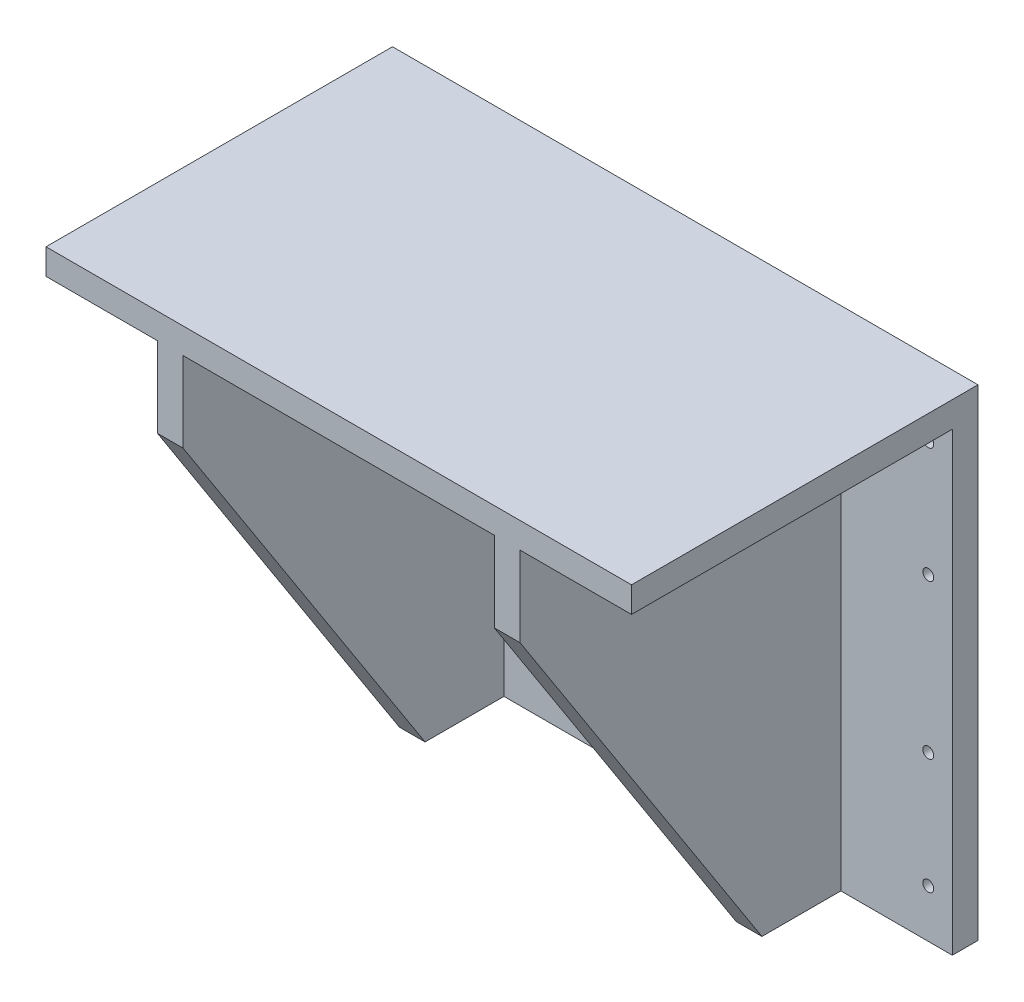
ISO-10303-21;
HEADER;
FILE_DESCRIPTION(('STEP AP214'),'2;1');
FILE_NAME('part.step','',(''),(''),'','','');
FILE_SCHEMA(('AUTOMOTIVE_DESIGN { 1 0 10303 214 1 1 1 1 }'));
ENDSEC;
DATA;
#1=APPLICATION_CONTEXT('core data for automotive mechanical design processes');
#2=APPLICATION_PROTOCOL_DEFINITION('international standard','automotive_design',2000,#1);
#3=PRODUCT_CONTEXT('',#1,'mechanical');
#4=PRODUCT('Part','Part','',(#3));
#5=PRODUCT_RELATED_PRODUCT_CATEGORY('part','',(#4));
#6=PRODUCT_DEFINITION_FORMATION('','',#4);
#7=PRODUCT_DEFINITION_CONTEXT('part definition',#1,'design');
#8=PRODUCT_DEFINITION('design','',#6,#7);
#9=PRODUCT_DEFINITION_SHAPE('','',#8);
#10=(LENGTH_UNIT() NAMED_UNIT(*) SI_UNIT(.MILLI.,.METRE.));
#11=(NAMED_UNIT(*) PLANE_ANGLE_UNIT() SI_UNIT($,.RADIAN.));
#12=(NAMED_UNIT(*) SI_UNIT($,.STERADIAN.) SOLID_ANGLE_UNIT());
#13=UNCERTAINTY_MEASURE_WITH_UNIT(LENGTH_MEASURE(1.E-05),#10,'distance_accuracy_value','');
#14=(GEOMETRIC_REPRESENTATION_CONTEXT(3) GLOBAL_UNCERTAINTY_ASSIGNED_CONTEXT((#13)) GLOBAL_UNIT_ASSIGNED_CONTEXT((#10,
#11,#12)) REPRESENTATION_CONTEXT('',''));
#15=CARTESIAN_POINT('',(0.,0.,0.));
#16=DIRECTION('',(0.,0.,1.));
#17=DIRECTION('',(1.,0.,0.));
#18=AXIS2_PLACEMENT_3D('',#15,#16,#17);
#19=CARTESIAN_POINT('',(-182.5,-300.,16.));
#20=DIRECTION('',(0.,0.,1.));
#21=DIRECTION('',(1.,0.,0.));
#22=AXIS2_PLACEMENT_3D('',#19,#20,#21);
#23=PLANE('',#22);
#24=DIRECTION('',(1.,0.,0.));
#25=VECTOR('',#24,1.);
#26=CARTESIAN_POINT('',(-182.5,-16.,16.));
#27=LINE('',#26,#25);
#28=CARTESIAN_POINT('',(-97.,-16.,16.));
#29=VERTEX_POINT('',#28);
#30=CARTESIAN_POINT('',(97.,-16.,16.));
#31=VERTEX_POINT('',#30);
#32=EDGE_CURVE('E38',#29,#31,#27,.T.);
#33=ORIENTED_EDGE('',*,*,#32,.F.);
#34=DIRECTION('',(0.,-1.,0.));
#35=VECTOR('',#34,1.);
#36=CARTESIAN_POINT('',(-97.,-16.,16.));
#37=LINE('',#36,#35);
#38=CARTESIAN_POINT('',(-97.,-300.,16.));
#39=VERTEX_POINT('',#38);
#40=EDGE_CURVE('E226',#29,#39,#37,.T.);
#41=ORIENTED_EDGE('',*,*,#40,.T.);
#42=DIRECTION('',(1.,0.,0.));
#43=VECTOR('',#42,1.);
#44=CARTESIAN_POINT('',(-182.5,-300.,16.));
#45=LINE('',#44,#43);
#46=CARTESIAN_POINT('',(97.,-300.,16.));
#47=VERTEX_POINT('',#46);
#48=EDGE_CURVE('E384',#39,#47,#45,.T.);
#49=ORIENTED_EDGE('',*,*,#48,.T.);
#50=DIRECTION('',(0.,1.,0.));
#51=VECTOR('',#50,1.);
#52=CARTESIAN_POINT('',(97.,-300.,16.));
#53=LINE('',#52,#51);
#54=EDGE_CURVE('E191',#47,#31,#53,.T.);
#55=ORIENTED_EDGE('',*,*,#54,.T.);
#56=EDGE_LOOP('',(#33,#41,#49,#55));
#57=FACE_BOUND('',#56,.T.);
#58=ADVANCED_FACE('F34',(#57),#23,.T.);
#59=CARTESIAN_POINT('',(-182.5,-16.,216.));
#60=DIRECTION('',(0.,1.,0.));
#61=DIRECTION('',(-1.,0.,0.));
#62=AXIS2_PLACEMENT_3D('',#59,#60,#61);
#63=PLANE('',#62);
#64=DIRECTION('',(0.,0.,-1.));
#65=VECTOR('',#64,1.);
#66=CARTESIAN_POINT('',(-97.,-16.,216.));
#67=LINE('',#66,#65);
#68=CARTESIAN_POINT('',(-97.,-16.,216.));
#69=VERTEX_POINT('',#68);
#70=EDGE_CURVE('E229',#69,#29,#67,.T.);
#71=ORIENTED_EDGE('',*,*,#70,.T.);
#72=ORIENTED_EDGE('',*,*,#32,.T.);
#73=DIRECTION('',(0.,0.,1.));
#74=VECTOR('',#73,1.);
#75=CARTESIAN_POINT('',(97.,-16.,16.));
#76=LINE('',#75,#74);
#77=CARTESIAN_POINT('',(97.,-16.,216.));
#78=VERTEX_POINT('',#77);
#79=EDGE_CURVE('E196',#31,#78,#76,.T.);
#80=ORIENTED_EDGE('',*,*,#79,.T.);
#81=DIRECTION('',(1.,0.,0.));
#82=VECTOR('',#81,1.);
#83=CARTESIAN_POINT('',(-182.5,-16.,216.));
#84=LINE('',#83,#82);
#85=EDGE_CURVE('E177',#69,#78,#84,.T.);
#86=ORIENTED_EDGE('',*,*,#85,.F.);
#87=EDGE_LOOP('',(#71,#72,#80,#86));
#88=FACE_BOUND('',#87,.T.);
#89=ADVANCED_FACE('F291',(#88),#63,.F.);
#90=CARTESIAN_POINT('',(-167.5,-30.,16.));
#91=DIRECTION('',(0.,0.,1.));
#92=DIRECTION('',(1.,0.,0.));
#93=AXIS2_PLACEMENT_3D('',#90,#91,#92);
#94=CIRCLE('',#93,3.39999999999999);
#95=CARTESIAN_POINT('',(-164.1,-30.,16.));
#96=VERTEX_POINT('',#95);
#97=EDGE_CURVE('E282',#96,#96,#94,.T.);
#98=ORIENTED_EDGE('',*,*,#97,.F.);
#99=EDGE_LOOP('',(#98));
#100=FACE_BOUND('',#99,.T.);
#101=CARTESIAN_POINT('',(-167.5,-270.,16.));
#102=DIRECTION('',(0.,0.,1.));
#103=DIRECTION('',(1.,0.,0.));
#104=AXIS2_PLACEMENT_3D('',#101,#102,#103);
#105=CIRCLE('',#104,3.39999999999999);
#106=CARTESIAN_POINT('',(-164.1,-270.,16.));
#107=VERTEX_POINT('',#106);
#108=EDGE_CURVE('E276',#107,#107,#105,.T.);
#109=ORIENTED_EDGE('',*,*,#108,.F.);
#110=EDGE_LOOP('',(#109));
#111=FACE_BOUND('',#110,.T.);
#112=CARTESIAN_POINT('',(-167.5,-198.,16.));
#113=DIRECTION('',(0.,0.,1.));
#114=DIRECTION('',(1.,0.,0.));
#115=AXIS2_PLACEMENT_3D('',#112,#113,#114);
#116=CIRCLE('',#115,3.39999999999999);
#117=CARTESIAN_POINT('',(-164.1,-198.,16.));
#118=VERTEX_POINT('',#117);
#119=EDGE_CURVE('E270',#118,#118,#116,.T.);
#120=ORIENTED_EDGE('',*,*,#119,.F.);
#121=EDGE_LOOP('',(#120));
#122=FACE_BOUND('',#121,.T.);
#123=CARTESIAN_POINT('',(-167.5,-102.,16.));
#124=DIRECTION('',(0.,0.,1.));
#125=DIRECTION('',(1.,0.,0.));
#126=AXIS2_PLACEMENT_3D('',#123,#124,#125);
#127=CIRCLE('',#126,3.39999999999999);
#128=CARTESIAN_POINT('',(-164.1,-102.,16.));
#129=VERTEX_POINT('',#128);
#130=EDGE_CURVE('E264',#129,#129,#127,.T.);
#131=ORIENTED_EDGE('',*,*,#130,.F.);
#132=EDGE_LOOP('',(#131));
#133=FACE_BOUND('',#132,.T.);
#134=DIRECTION('',(0.,-1.,0.));
#135=VECTOR('',#134,1.);
#136=CARTESIAN_POINT('',(-113.,-16.,16.));
#137=LINE('',#136,#135);
#138=CARTESIAN_POINT('',(-113.,-16.,16.));
#139=VERTEX_POINT('',#138);
#140=CARTESIAN_POINT('',(-113.,-300.,16.));
#141=VERTEX_POINT('',#140);
#142=EDGE_CURVE('E169',#139,#141,#137,.T.);
#143=ORIENTED_EDGE('',*,*,#142,.F.);
#144=CARTESIAN_POINT('',(-182.5,-16.,16.));
#145=VERTEX_POINT('',#144);
#146=EDGE_CURVE('E168',#145,#139,#27,.T.);
#147=ORIENTED_EDGE('',*,*,#146,.F.);
#148=DIRECTION('',(0.,-1.,0.));
#149=VECTOR('',#148,1.);
#150=CARTESIAN_POINT('',(-182.5,0.,16.));
#151=LINE('',#150,#149);
#152=CARTESIAN_POINT('',(-182.5,-300.,16.));
#153=VERTEX_POINT('',#152);
#154=EDGE_CURVE('E376',#145,#153,#151,.T.);
#155=ORIENTED_EDGE('',*,*,#154,.T.);
#156=EDGE_CURVE('E303',#153,#141,#45,.T.);
#157=ORIENTED_EDGE('',*,*,#156,.T.);
#158=EDGE_LOOP('',(#143,#147,#155,#157));
#159=FACE_BOUND('',#158,.T.);
#160=ADVANCED_FACE('F288',(#100,#111,#122,#133,#159),#23,.T.);
#161=ORIENTED_EDGE('',*,*,#146,.T.);
#162=DIRECTION('',(0.,0.,-1.));
#163=VECTOR('',#162,1.);
#164=CARTESIAN_POINT('',(-113.,-16.,216.));
#165=LINE('',#164,#163);
#166=CARTESIAN_POINT('',(-113.,-16.,216.));
#167=VERTEX_POINT('',#166);
#168=EDGE_CURVE('E154',#167,#139,#165,.T.);
#169=ORIENTED_EDGE('',*,*,#168,.F.);
#170=CARTESIAN_POINT('',(-182.5,-16.,216.));
#171=VERTEX_POINT('',#170);
#172=EDGE_CURVE('E166',#171,#167,#84,.T.);
#173=ORIENTED_EDGE('',*,*,#172,.F.);
#174=DIRECTION('',(0.,0.,-1.));
#175=VECTOR('',#174,1.);
#176=CARTESIAN_POINT('',(-182.5,-16.,216.));
#177=LINE('',#176,#175);
#178=EDGE_CURVE('E338',#171,#145,#177,.T.);
#179=ORIENTED_EDGE('',*,*,#178,.T.);
#180=EDGE_LOOP('',(#161,#169,#173,#179));
#181=FACE_BOUND('',#180,.T.);
#182=ADVANCED_FACE('F164',(#181),#63,.F.);
#183=CARTESIAN_POINT('',(-182.5,0.,16.));
#184=DIRECTION('',(1.,0.,0.));
#185=DIRECTION('',(0.,1.,0.));
#186=AXIS2_PLACEMENT_3D('',#183,#184,#185);
#187=PLANE('',#186);
#188=DIRECTION('',(0.,-1.,0.));
#189=VECTOR('',#188,1.);
#190=CARTESIAN_POINT('',(-182.5,0.,0.));
#191=LINE('',#190,#189);
#192=CARTESIAN_POINT('',(-182.5,0.,0.));
#193=VERTEX_POINT('',#192);
#194=CARTESIAN_POINT('',(-182.5,-300.,0.));
#195=VERTEX_POINT('',#194);
#196=EDGE_CURVE('E361',#193,#195,#191,.T.);
#197=ORIENTED_EDGE('',*,*,#196,.T.);
#198=DIRECTION('',(0.,0.,-1.));
#199=VECTOR('',#198,1.);
#200=CARTESIAN_POINT('',(-182.5,-300.,16.));
#201=LINE('',#200,#199);
#202=EDGE_CURVE('E11',#153,#195,#201,.T.);
#203=ORIENTED_EDGE('',*,*,#202,.F.);
#204=ORIENTED_EDGE('',*,*,#154,.F.);
#205=ORIENTED_EDGE('',*,*,#178,.F.);
#206=DIRECTION('',(0.,-1.,0.));
#207=VECTOR('',#206,1.);
#208=CARTESIAN_POINT('',(-182.5,0.,216.));
#209=LINE('',#208,#207);
#210=CARTESIAN_POINT('',(-182.5,0.,216.));
#211=VERTEX_POINT('',#210);
#212=EDGE_CURVE('E174',#211,#171,#209,.T.);
#213=ORIENTED_EDGE('',*,*,#212,.F.);
#214=DIRECTION('',(0.,0.,-1.));
#215=VECTOR('',#214,1.);
#216=CARTESIAN_POINT('',(-182.5,0.,16.));
#217=LINE('',#216,#215);
#218=EDGE_CURVE('E348',#211,#193,#217,.T.);
#219=ORIENTED_EDGE('',*,*,#218,.T.);
#220=EDGE_LOOP('',(#197,#203,#204,#205,#213,#219));
#221=FACE_BOUND('',#220,.T.);
#222=ADVANCED_FACE('F36',(#221),#187,.F.);
#223=CARTESIAN_POINT('',(-182.5,-300.,16.));
#224=DIRECTION('',(0.,1.,0.));
#225=DIRECTION('',(-1.,0.,0.));
#226=AXIS2_PLACEMENT_3D('',#223,#224,#225);
#227=PLANE('',#226);
#228=DIRECTION('',(1.,0.,0.));
#229=VECTOR('',#228,1.);
#230=CARTESIAN_POINT('',(-182.5,-300.,0.));
#231=LINE('',#230,#229);
#232=CARTESIAN_POINT('',(182.5,-300.,0.));
#233=VERTEX_POINT('',#232);
#234=EDGE_CURVE('E364',#195,#233,#231,.T.);
#235=ORIENTED_EDGE('',*,*,#234,.T.);
#236=DIRECTION('',(0.,0.,-1.));
#237=VECTOR('',#236,1.);
#238=CARTESIAN_POINT('',(182.5,-300.,16.));
#239=LINE('',#238,#237);
#240=CARTESIAN_POINT('',(182.5,-300.,16.));
#241=VERTEX_POINT('',#240);
#242=EDGE_CURVE('E44',#241,#233,#239,.T.);
#243=ORIENTED_EDGE('',*,*,#242,.F.);
#244=CARTESIAN_POINT('',(113.,-300.,16.));
#245=VERTEX_POINT('',#244);
#246=EDGE_CURVE('E382',#245,#241,#45,.T.);
#247=ORIENTED_EDGE('',*,*,#246,.F.);
#248=DIRECTION('',(0.,0.,-1.));
#249=VECTOR('',#248,1.);
#250=CARTESIAN_POINT('',(113.,-300.,65.1972906382398));
#251=LINE('',#250,#249);
#252=CARTESIAN_POINT('',(113.,-300.,65.1972906382398));
#253=VERTEX_POINT('',#252);
#254=EDGE_CURVE('E197',#253,#245,#251,.T.);
#255=ORIENTED_EDGE('',*,*,#254,.F.);
#256=DIRECTION('',(1.,0.,0.));
#257=VECTOR('',#256,1.);
#258=CARTESIAN_POINT('',(97.,-300.,65.1972906382398));
#259=LINE('',#258,#257);
#260=CARTESIAN_POINT('',(97.,-300.,65.1972906382398));
#261=VERTEX_POINT('',#260);
#262=EDGE_CURVE('E190',#261,#253,#259,.T.);
#263=ORIENTED_EDGE('',*,*,#262,.F.);
#264=DIRECTION('',(0.,0.,-1.));
#265=VECTOR('',#264,1.);
#266=CARTESIAN_POINT('',(97.,-300.,65.1972906382398));
#267=LINE('',#266,#265);
#268=EDGE_CURVE('E208',#261,#47,#267,.T.);
#269=ORIENTED_EDGE('',*,*,#268,.T.);
#270=ORIENTED_EDGE('',*,*,#48,.F.);
#271=DIRECTION('',(0.,0.,1.));
#272=VECTOR('',#271,1.);
#273=CARTESIAN_POINT('',(-97.,-300.,16.));
#274=LINE('',#273,#272);
#275=CARTESIAN_POINT('',(-97.,-300.,65.1972906382398));
#276=VERTEX_POINT('',#275);
#277=EDGE_CURVE('E224',#39,#276,#274,.T.);
#278=ORIENTED_EDGE('',*,*,#277,.T.);
#279=DIRECTION('',(1.,0.,0.));
#280=VECTOR('',#279,1.);
#281=CARTESIAN_POINT('',(-113.,-300.,65.1972906382398));
#282=LINE('',#281,#280);
#283=CARTESIAN_POINT('',(-113.,-300.,65.1972906382398));
#284=VERTEX_POINT('',#283);
#285=EDGE_CURVE('E205',#284,#276,#282,.T.);
#286=ORIENTED_EDGE('',*,*,#285,.F.);
#287=DIRECTION('',(0.,0.,1.));
#288=VECTOR('',#287,1.);
#289=CARTESIAN_POINT('',(-113.,-300.,16.));
#290=LINE('',#289,#288);
#291=EDGE_CURVE('E235',#141,#284,#290,.T.);
#292=ORIENTED_EDGE('',*,*,#291,.F.);
#293=ORIENTED_EDGE('',*,*,#156,.F.);
#294=ORIENTED_EDGE('',*,*,#202,.T.);
#295=EDGE_LOOP('',(#235,#243,#247,#255,#263,#269,#270,#278,#286,#292,#293,#294));
#296=FACE_BOUND('',#295,.T.);
#297=ADVANCED_FACE('F307',(#296),#227,.F.);
#298=CARTESIAN_POINT('',(182.5,0.,16.));
#299=DIRECTION('',(-1.,0.,0.));
#300=DIRECTION('',(0.,-1.,0.));
#301=AXIS2_PLACEMENT_3D('',#298,#299,#300);
#302=PLANE('',#301);
#303=DIRECTION('',(0.,1.,0.));
#304=VECTOR('',#303,1.);
#305=CARTESIAN_POINT('',(182.5,0.,0.));
#306=LINE('',#305,#304);
#307=CARTESIAN_POINT('',(182.5,0.,0.));
#308=VERTEX_POINT('',#307);
#309=EDGE_CURVE('E368',#233,#308,#306,.T.);
#310=ORIENTED_EDGE('',*,*,#309,.T.);
#311=DIRECTION('',(0.,0.,-1.));
#312=VECTOR('',#311,1.);
#313=CARTESIAN_POINT('',(182.5,0.,16.));
#314=LINE('',#313,#312);
#315=CARTESIAN_POINT('',(182.5,0.,216.));
#316=VERTEX_POINT('',#315);
#317=EDGE_CURVE('E342',#316,#308,#314,.T.);
#318=ORIENTED_EDGE('',*,*,#317,.F.);
#319=DIRECTION('',(0.,1.,0.));
#320=VECTOR('',#319,1.);
#321=CARTESIAN_POINT('',(182.5,0.,216.));
#322=LINE('',#321,#320);
#323=CARTESIAN_POINT('',(182.5,-16.,216.));
#324=VERTEX_POINT('',#323);
#325=EDGE_CURVE('E176',#324,#316,#322,.T.);
#326=ORIENTED_EDGE('',*,*,#325,.F.);
#327=DIRECTION('',(0.,0.,-1.));
#328=VECTOR('',#327,1.);
#329=CARTESIAN_POINT('',(182.5,-16.,216.));
#330=LINE('',#329,#328);
#331=CARTESIAN_POINT('',(182.5,-16.,16.));
#332=VERTEX_POINT('',#331);
#333=EDGE_CURVE('E333',#324,#332,#330,.T.);
#334=ORIENTED_EDGE('',*,*,#333,.T.);
#335=DIRECTION('',(0.,1.,0.));
#336=VECTOR('',#335,1.);
#337=CARTESIAN_POINT('',(182.5,0.,16.));
#338=LINE('',#337,#336);
#339=EDGE_CURVE('E378',#241,#332,#338,.T.);
#340=ORIENTED_EDGE('',*,*,#339,.F.);
#341=ORIENTED_EDGE('',*,*,#242,.T.);
#342=EDGE_LOOP('',(#310,#318,#326,#334,#340,#341));
#343=FACE_BOUND('',#342,.T.);
#344=ADVANCED_FACE('F340',(#343),#302,.F.);
#345=CARTESIAN_POINT('',(-182.5,0.,16.));
#346=DIRECTION('',(0.,-1.,0.));
#347=DIRECTION('',(1.,0.,0.));
#348=AXIS2_PLACEMENT_3D('',#345,#346,#347);
#349=PLANE('',#348);
#350=DIRECTION('',(-1.,0.,0.));
#351=VECTOR('',#350,1.);
#352=CARTESIAN_POINT('',(-182.5,0.,0.));
#353=LINE('',#352,#351);
#354=EDGE_CURVE('E374',#308,#193,#353,.T.);
#355=ORIENTED_EDGE('',*,*,#354,.T.);
#356=ORIENTED_EDGE('',*,*,#218,.F.);
#357=DIRECTION('',(-1.,0.,0.));
#358=VECTOR('',#357,1.);
#359=CARTESIAN_POINT('',(-182.5,0.,216.));
#360=LINE('',#359,#358);
#361=EDGE_CURVE('E181',#316,#211,#360,.T.);
#362=ORIENTED_EDGE('',*,*,#361,.F.);
#363=ORIENTED_EDGE('',*,*,#317,.T.);
#364=EDGE_LOOP('',(#355,#356,#362,#363));
#365=FACE_BOUND('',#364,.T.);
#366=ADVANCED_FACE('F345',(#365),#349,.F.);
#367=CARTESIAN_POINT('',(167.5,-30.,16.));
#368=DIRECTION('',(0.,0.,1.));
#369=DIRECTION('',(1.,0.,0.));
#370=AXIS2_PLACEMENT_3D('',#367,#368,#369);
#371=CIRCLE('',#370,3.39999999999999);
#372=CARTESIAN_POINT('',(170.9,-30.,16.));
#373=VERTEX_POINT('',#372);
#374=EDGE_CURVE('E258',#373,#373,#371,.T.);
#375=ORIENTED_EDGE('',*,*,#374,.F.);
#376=EDGE_LOOP('',(#375));
#377=FACE_BOUND('',#376,.T.);
#378=CARTESIAN_POINT('',(167.5,-270.,16.));
#379=DIRECTION('',(0.,0.,1.));
#380=DIRECTION('',(1.,0.,0.));
#381=AXIS2_PLACEMENT_3D('',#378,#379,#380);
#382=CIRCLE('',#381,3.39999999999999);
#383=CARTESIAN_POINT('',(170.9,-270.,16.));
#384=VERTEX_POINT('',#383);
#385=EDGE_CURVE('E252',#384,#384,#382,.T.);
#386=ORIENTED_EDGE('',*,*,#385,.F.);
#387=EDGE_LOOP('',(#386));
#388=FACE_BOUND('',#387,.T.);
#389=CARTESIAN_POINT('',(167.5,-198.,16.));
#390=DIRECTION('',(0.,0.,1.));
#391=DIRECTION('',(1.,0.,0.));
#392=AXIS2_PLACEMENT_3D('',#389,#390,#391);
#393=CIRCLE('',#392,3.39999999999999);
#394=CARTESIAN_POINT('',(170.9,-198.,16.));
#395=VERTEX_POINT('',#394);
#396=EDGE_CURVE('E246',#395,#395,#393,.T.);
#397=ORIENTED_EDGE('',*,*,#396,.F.);
#398=EDGE_LOOP('',(#397));
#399=FACE_BOUND('',#398,.T.);
#400=CARTESIAN_POINT('',(167.5,-102.,16.));
#401=DIRECTION('',(0.,0.,1.));
#402=DIRECTION('',(1.,0.,0.));
#403=AXIS2_PLACEMENT_3D('',#400,#401,#402);
#404=CIRCLE('',#403,3.39999999999999);
#405=CARTESIAN_POINT('',(170.9,-102.,16.));
#406=VERTEX_POINT('',#405);
#407=EDGE_CURVE('E240',#406,#406,#404,.T.);
#408=ORIENTED_EDGE('',*,*,#407,.F.);
#409=EDGE_LOOP('',(#408));
#410=FACE_BOUND('',#409,.T.);
#411=DIRECTION('',(0.,1.,0.));
#412=VECTOR('',#411,1.);
#413=CARTESIAN_POINT('',(113.,-300.,16.));
#414=LINE('',#413,#412);
#415=CARTESIAN_POINT('',(113.,-16.,16.));
#416=VERTEX_POINT('',#415);
#417=EDGE_CURVE('E194',#245,#416,#414,.T.);
#418=ORIENTED_EDGE('',*,*,#417,.F.);
#419=ORIENTED_EDGE('',*,*,#246,.T.);
#420=ORIENTED_EDGE('',*,*,#339,.T.);
#421=EDGE_CURVE('E193',#416,#332,#27,.T.);
#422=ORIENTED_EDGE('',*,*,#421,.F.);
#423=EDGE_LOOP('',(#418,#419,#420,#422));
#424=FACE_BOUND('',#423,.T.);
#425=ADVANCED_FACE('F293',(#377,#388,#399,#410,#424),#23,.T.);
#426=CARTESIAN_POINT('',(-182.5,-300.,0.));
#427=DIRECTION('',(0.,0.,1.));
#428=DIRECTION('',(1.,0.,0.));
#429=AXIS2_PLACEMENT_3D('',#426,#427,#428);
#430=PLANE('',#429);
#431=CARTESIAN_POINT('',(-167.5,-30.,0.));
#432=DIRECTION('',(0.,0.,1.));
#433=DIRECTION('',(1.,0.,0.));
#434=AXIS2_PLACEMENT_3D('',#431,#432,#433);
#435=CIRCLE('',#434,3.39999999999999);
#436=CARTESIAN_POINT('',(-164.1,-30.,0.));
#437=VERTEX_POINT('',#436);
#438=EDGE_CURVE('E279',#437,#437,#435,.T.);
#439=ORIENTED_EDGE('',*,*,#438,.T.);
#440=EDGE_LOOP('',(#439));
#441=FACE_BOUND('',#440,.T.);
#442=CARTESIAN_POINT('',(-167.5,-270.,0.));
#443=DIRECTION('',(0.,0.,1.));
#444=DIRECTION('',(1.,0.,0.));
#445=AXIS2_PLACEMENT_3D('',#442,#443,#444);
#446=CIRCLE('',#445,3.39999999999999);
#447=CARTESIAN_POINT('',(-164.1,-270.,0.));
#448=VERTEX_POINT('',#447);
#449=EDGE_CURVE('E273',#448,#448,#446,.T.);
#450=ORIENTED_EDGE('',*,*,#449,.T.);
#451=EDGE_LOOP('',(#450));
#452=FACE_BOUND('',#451,.T.);
#453=CARTESIAN_POINT('',(-167.5,-198.,0.));
#454=DIRECTION('',(0.,0.,1.));
#455=DIRECTION('',(1.,0.,0.));
#456=AXIS2_PLACEMENT_3D('',#453,#454,#455);
#457=CIRCLE('',#456,3.39999999999999);
#458=CARTESIAN_POINT('',(-164.1,-198.,0.));
#459=VERTEX_POINT('',#458);
#460=EDGE_CURVE('E267',#459,#459,#457,.T.);
#461=ORIENTED_EDGE('',*,*,#460,.T.);
#462=EDGE_LOOP('',(#461));
#463=FACE_BOUND('',#462,.T.);
#464=CARTESIAN_POINT('',(-167.5,-102.,0.));
#465=DIRECTION('',(0.,0.,1.));
#466=DIRECTION('',(1.,0.,0.));
#467=AXIS2_PLACEMENT_3D('',#464,#465,#466);
#468=CIRCLE('',#467,3.39999999999999);
#469=CARTESIAN_POINT('',(-164.1,-102.,0.));
#470=VERTEX_POINT('',#469);
#471=EDGE_CURVE('E261',#470,#470,#468,.T.);
#472=ORIENTED_EDGE('',*,*,#471,.T.);
#473=EDGE_LOOP('',(#472));
#474=FACE_BOUND('',#473,.T.);
#475=CARTESIAN_POINT('',(167.5,-30.,0.));
#476=DIRECTION('',(0.,0.,1.));
#477=DIRECTION('',(1.,0.,0.));
#478=AXIS2_PLACEMENT_3D('',#475,#476,#477);
#479=CIRCLE('',#478,3.39999999999999);
#480=CARTESIAN_POINT('',(170.9,-30.,0.));
#481=VERTEX_POINT('',#480);
#482=EDGE_CURVE('E255',#481,#481,#479,.T.);
#483=ORIENTED_EDGE('',*,*,#482,.T.);
#484=EDGE_LOOP('',(#483));
#485=FACE_BOUND('',#484,.T.);
#486=CARTESIAN_POINT('',(167.5,-270.,0.));
#487=DIRECTION('',(0.,0.,1.));
#488=DIRECTION('',(1.,0.,0.));
#489=AXIS2_PLACEMENT_3D('',#486,#487,#488);
#490=CIRCLE('',#489,3.39999999999999);
#491=CARTESIAN_POINT('',(170.9,-270.,0.));
#492=VERTEX_POINT('',#491);
#493=EDGE_CURVE('E249',#492,#492,#490,.T.);
#494=ORIENTED_EDGE('',*,*,#493,.T.);
#495=EDGE_LOOP('',(#494));
#496=FACE_BOUND('',#495,.T.);
#497=CARTESIAN_POINT('',(167.5,-198.,0.));
#498=DIRECTION('',(0.,0.,1.));
#499=DIRECTION('',(1.,0.,0.));
#500=AXIS2_PLACEMENT_3D('',#497,#498,#499);
#501=CIRCLE('',#500,3.39999999999999);
#502=CARTESIAN_POINT('',(170.9,-198.,0.));
#503=VERTEX_POINT('',#502);
#504=EDGE_CURVE('E243',#503,#503,#501,.T.);
#505=ORIENTED_EDGE('',*,*,#504,.T.);
#506=EDGE_LOOP('',(#505));
#507=FACE_BOUND('',#506,.T.);
#508=CARTESIAN_POINT('',(167.5,-102.,0.));
#509=DIRECTION('',(0.,0.,1.));
#510=DIRECTION('',(1.,0.,0.));
#511=AXIS2_PLACEMENT_3D('',#508,#509,#510);
#512=CIRCLE('',#511,3.39999999999999);
#513=CARTESIAN_POINT('',(170.9,-102.,0.));
#514=VERTEX_POINT('',#513);
#515=EDGE_CURVE('E233',#514,#514,#512,.T.);
#516=ORIENTED_EDGE('',*,*,#515,.T.);
#517=EDGE_LOOP('',(#516));
#518=FACE_BOUND('',#517,.T.);
#519=ORIENTED_EDGE('',*,*,#196,.F.);
#520=ORIENTED_EDGE('',*,*,#354,.F.);
#521=ORIENTED_EDGE('',*,*,#309,.F.);
#522=ORIENTED_EDGE('',*,*,#234,.F.);
#523=EDGE_LOOP('',(#519,#520,#521,#522));
#524=FACE_BOUND('',#523,.T.);
#525=ADVANCED_FACE('F390',(#441,#452,#463,#474,#485,#496,#507,#518,#524),#430,.F.);
#526=CARTESIAN_POINT('',(113.,-16.,216.));
#527=VERTEX_POINT('',#526);
#528=EDGE_CURVE('E179',#527,#324,#84,.T.);
#529=ORIENTED_EDGE('',*,*,#528,.F.);
#530=DIRECTION('',(0.,0.,1.));
#531=VECTOR('',#530,1.);
#532=CARTESIAN_POINT('',(113.,-16.,16.));
#533=LINE('',#532,#531);
#534=EDGE_CURVE('E60',#416,#527,#533,.T.);
#535=ORIENTED_EDGE('',*,*,#534,.F.);
#536=ORIENTED_EDGE('',*,*,#421,.T.);
#537=ORIENTED_EDGE('',*,*,#333,.F.);
#538=EDGE_LOOP('',(#529,#535,#536,#537));
#539=FACE_BOUND('',#538,.T.);
#540=ADVANCED_FACE('F330',(#539),#63,.F.);
#541=CARTESIAN_POINT('',(-182.5,-16.,216.));
#542=DIRECTION('',(0.,0.,1.));
#543=DIRECTION('',(1.,0.,0.));
#544=AXIS2_PLACEMENT_3D('',#541,#542,#543);
#545=PLANE('',#544);
#546=ORIENTED_EDGE('',*,*,#212,.T.);
#547=ORIENTED_EDGE('',*,*,#172,.T.);
#548=DIRECTION('',(0.,1.,0.));
#549=VECTOR('',#548,1.);
#550=CARTESIAN_POINT('',(-113.,-66.,216.));
#551=LINE('',#550,#549);
#552=CARTESIAN_POINT('',(-113.,-66.,216.));
#553=VERTEX_POINT('',#552);
#554=EDGE_CURVE('E151',#553,#167,#551,.T.);
#555=ORIENTED_EDGE('',*,*,#554,.F.);
#556=DIRECTION('',(1.,0.,0.));
#557=VECTOR('',#556,1.);
#558=CARTESIAN_POINT('',(-113.,-66.,216.));
#559=LINE('',#558,#557);
#560=CARTESIAN_POINT('',(-97.,-66.,216.));
#561=VERTEX_POINT('',#560);
#562=EDGE_CURVE('E221',#553,#561,#559,.T.);
#563=ORIENTED_EDGE('',*,*,#562,.T.);
#564=DIRECTION('',(0.,1.,0.));
#565=VECTOR('',#564,1.);
#566=CARTESIAN_POINT('',(-97.,-66.,216.));
#567=LINE('',#566,#565);
#568=EDGE_CURVE('E52',#561,#69,#567,.T.);
#569=ORIENTED_EDGE('',*,*,#568,.T.);
#570=ORIENTED_EDGE('',*,*,#85,.T.);
#571=DIRECTION('',(0.,-1.,0.));
#572=VECTOR('',#571,1.);
#573=CARTESIAN_POINT('',(97.,-16.,216.));
#574=LINE('',#573,#572);
#575=CARTESIAN_POINT('',(97.,-66.,216.));
#576=VERTEX_POINT('',#575);
#577=EDGE_CURVE('E214',#78,#576,#574,.T.);
#578=ORIENTED_EDGE('',*,*,#577,.T.);
#579=DIRECTION('',(1.,0.,0.));
#580=VECTOR('',#579,1.);
#581=CARTESIAN_POINT('',(97.,-66.,216.));
#582=LINE('',#581,#580);
#583=CARTESIAN_POINT('',(113.,-66.,216.));
#584=VERTEX_POINT('',#583);
#585=EDGE_CURVE('E188',#576,#584,#582,.T.);
#586=ORIENTED_EDGE('',*,*,#585,.T.);
#587=DIRECTION('',(0.,-1.,0.));
#588=VECTOR('',#587,1.);
#589=CARTESIAN_POINT('',(113.,-16.,216.));
#590=LINE('',#589,#588);
#591=EDGE_CURVE('E202',#527,#584,#590,.T.);
#592=ORIENTED_EDGE('',*,*,#591,.F.);
#593=ORIENTED_EDGE('',*,*,#528,.T.);
#594=ORIENTED_EDGE('',*,*,#325,.T.);
#595=ORIENTED_EDGE('',*,*,#361,.T.);
#596=EDGE_LOOP('',(#546,#547,#555,#563,#569,#570,#578,#586,#592,#593,#594,#595));
#597=FACE_BOUND('',#596,.T.);
#598=ADVANCED_FACE('F171',(#597),#545,.T.);
#599=CARTESIAN_POINT('',(97.,-66.,216.));
#600=DIRECTION('',(0.,-0.541708210282742,0.840566603495683));
#601=DIRECTION('',(0.,-0.840566603495683,-0.541708210282742));
#602=AXIS2_PLACEMENT_3D('',#599,#600,#601);
#603=PLANE('',#602);
#604=DIRECTION('',(0.,-0.840566603495683,-0.541708210282742));
#605=VECTOR('',#604,1.);
#606=CARTESIAN_POINT('',(113.,-66.,216.));
#607=LINE('',#606,#605);
#608=EDGE_CURVE('E199',#584,#253,#607,.T.);
#609=ORIENTED_EDGE('',*,*,#608,.F.);
#610=ORIENTED_EDGE('',*,*,#585,.F.);
#611=DIRECTION('',(0.,-0.840566603495683,-0.541708210282742));
#612=VECTOR('',#611,1.);
#613=CARTESIAN_POINT('',(97.,-66.,216.));
#614=LINE('',#613,#612);
#615=EDGE_CURVE('E211',#576,#261,#614,.T.);
#616=ORIENTED_EDGE('',*,*,#615,.T.);
#617=ORIENTED_EDGE('',*,*,#262,.T.);
#618=EDGE_LOOP('',(#609,#610,#616,#617));
#619=FACE_BOUND('',#618,.T.);
#620=ADVANCED_FACE('F327',(#619),#603,.T.);
#621=CARTESIAN_POINT('',(97.,-16.,216.));
#622=DIRECTION('',(1.,0.,0.));
#623=DIRECTION('',(0.,0.,-1.));
#624=AXIS2_PLACEMENT_3D('',#621,#622,#623);
#625=PLANE('',#624);
#626=ORIENTED_EDGE('',*,*,#79,.F.);
#627=ORIENTED_EDGE('',*,*,#54,.F.);
#628=ORIENTED_EDGE('',*,*,#268,.F.);
#629=ORIENTED_EDGE('',*,*,#615,.F.);
#630=ORIENTED_EDGE('',*,*,#577,.F.);
#631=EDGE_LOOP('',(#626,#627,#628,#629,#630));
#632=FACE_BOUND('',#631,.T.);
#633=ADVANCED_FACE('F322',(#632),#625,.F.);
#634=CARTESIAN_POINT('',(113.,-16.,216.));
#635=DIRECTION('',(1.,0.,0.));
#636=DIRECTION('',(0.,0.,-1.));
#637=AXIS2_PLACEMENT_3D('',#634,#635,#636);
#638=PLANE('',#637);
#639=ORIENTED_EDGE('',*,*,#534,.T.);
#640=ORIENTED_EDGE('',*,*,#591,.T.);
#641=ORIENTED_EDGE('',*,*,#608,.T.);
#642=ORIENTED_EDGE('',*,*,#254,.T.);
#643=ORIENTED_EDGE('',*,*,#417,.T.);
#644=EDGE_LOOP('',(#639,#640,#641,#642,#643));
#645=FACE_BOUND('',#644,.T.);
#646=ADVANCED_FACE('F439',(#645),#638,.T.);
#647=CARTESIAN_POINT('',(-113.,-300.,65.1972906382398));
#648=DIRECTION('',(0.,0.541708210282742,-0.840566603495683));
#649=DIRECTION('',(0.,0.840566603495683,0.541708210282742));
#650=AXIS2_PLACEMENT_3D('',#647,#648,#649);
#651=PLANE('',#650);
#652=DIRECTION('',(0.,0.840566603495683,0.541708210282742));
#653=VECTOR('',#652,1.);
#654=CARTESIAN_POINT('',(-97.,-300.,65.1972906382398));
#655=LINE('',#654,#653);
#656=EDGE_CURVE('E160',#276,#561,#655,.T.);
#657=ORIENTED_EDGE('',*,*,#656,.T.);
#658=ORIENTED_EDGE('',*,*,#562,.F.);
#659=DIRECTION('',(0.,0.840566603495683,0.541708210282742));
#660=VECTOR('',#659,1.);
#661=CARTESIAN_POINT('',(-113.,-300.,65.1972906382398));
#662=LINE('',#661,#660);
#663=EDGE_CURVE('E157',#284,#553,#662,.T.);
#664=ORIENTED_EDGE('',*,*,#663,.F.);
#665=ORIENTED_EDGE('',*,*,#285,.T.);
#666=EDGE_LOOP('',(#657,#658,#664,#665));
#667=FACE_BOUND('',#666,.T.);
#668=ADVANCED_FACE('F312',(#667),#651,.F.);
#669=CARTESIAN_POINT('',(-113.,-16.,216.));
#670=DIRECTION('',(-1.,0.,0.));
#671=DIRECTION('',(0.,0.,1.));
#672=AXIS2_PLACEMENT_3D('',#669,#670,#671);
#673=PLANE('',#672);
#674=ORIENTED_EDGE('',*,*,#554,.T.);
#675=ORIENTED_EDGE('',*,*,#168,.T.);
#676=ORIENTED_EDGE('',*,*,#142,.T.);
#677=ORIENTED_EDGE('',*,*,#291,.T.);
#678=ORIENTED_EDGE('',*,*,#663,.T.);
#679=EDGE_LOOP('',(#674,#675,#676,#677,#678));
#680=FACE_BOUND('',#679,.T.);
#681=ADVANCED_FACE('F153',(#680),#673,.T.);
#682=CARTESIAN_POINT('',(-97.,-16.,216.));
#683=DIRECTION('',(-1.,0.,0.));
#684=DIRECTION('',(0.,0.,1.));
#685=AXIS2_PLACEMENT_3D('',#682,#683,#684);
#686=PLANE('',#685);
#687=ORIENTED_EDGE('',*,*,#568,.F.);
#688=ORIENTED_EDGE('',*,*,#656,.F.);
#689=ORIENTED_EDGE('',*,*,#277,.F.);
#690=ORIENTED_EDGE('',*,*,#40,.F.);
#691=ORIENTED_EDGE('',*,*,#70,.F.);
#692=EDGE_LOOP('',(#687,#688,#689,#690,#691));
#693=FACE_BOUND('',#692,.T.);
#694=ADVANCED_FACE('F314',(#693),#686,.F.);
#695=CARTESIAN_POINT('',(167.5,-102.,16.));
#696=DIRECTION('',(0.,0.,1.));
#697=DIRECTION('',(1.,0.,0.));
#698=AXIS2_PLACEMENT_3D('',#695,#696,#697);
#699=CYLINDRICAL_SURFACE('',#698,3.39999999999999);
#700=ORIENTED_EDGE('',*,*,#515,.F.);
#701=EDGE_LOOP('',(#700));
#702=FACE_BOUND('',#701,.T.);
#703=ORIENTED_EDGE('',*,*,#407,.T.);
#704=EDGE_LOOP('',(#703));
#705=FACE_BOUND('',#704,.T.);
#706=ADVANCED_FACE('F419',(#702,#705),#699,.F.);
#707=CARTESIAN_POINT('',(167.5,-198.,16.));
#708=DIRECTION('',(0.,0.,1.));
#709=DIRECTION('',(1.,0.,0.));
#710=AXIS2_PLACEMENT_3D('',#707,#708,#709);
#711=CYLINDRICAL_SURFACE('',#710,3.39999999999999);
#712=ORIENTED_EDGE('',*,*,#504,.F.);
#713=EDGE_LOOP('',(#712));
#714=FACE_BOUND('',#713,.T.);
#715=ORIENTED_EDGE('',*,*,#396,.T.);
#716=EDGE_LOOP('',(#715));
#717=FACE_BOUND('',#716,.T.);
#718=ADVANCED_FACE('F421',(#714,#717),#711,.F.);
#719=CARTESIAN_POINT('',(167.5,-270.,16.));
#720=DIRECTION('',(0.,0.,1.));
#721=DIRECTION('',(1.,0.,0.));
#722=AXIS2_PLACEMENT_3D('',#719,#720,#721);
#723=CYLINDRICAL_SURFACE('',#722,3.39999999999999);
#724=ORIENTED_EDGE('',*,*,#493,.F.);
#725=EDGE_LOOP('',(#724));
#726=FACE_BOUND('',#725,.T.);
#727=ORIENTED_EDGE('',*,*,#385,.T.);
#728=EDGE_LOOP('',(#727));
#729=FACE_BOUND('',#728,.T.);
#730=ADVANCED_FACE('F428',(#726,#729),#723,.F.);
#731=CARTESIAN_POINT('',(167.5,-30.,16.));
#732=DIRECTION('',(0.,0.,1.));
#733=DIRECTION('',(1.,0.,0.));
#734=AXIS2_PLACEMENT_3D('',#731,#732,#733);
#735=CYLINDRICAL_SURFACE('',#734,3.39999999999999);
#736=ORIENTED_EDGE('',*,*,#482,.F.);
#737=EDGE_LOOP('',(#736));
#738=FACE_BOUND('',#737,.T.);
#739=ORIENTED_EDGE('',*,*,#374,.T.);
#740=EDGE_LOOP('',(#739));
#741=FACE_BOUND('',#740,.T.);
#742=ADVANCED_FACE('F512',(#738,#741),#735,.F.);
#743=CARTESIAN_POINT('',(-167.5,-102.,16.));
#744=DIRECTION('',(0.,0.,1.));
#745=DIRECTION('',(1.,0.,0.));
#746=AXIS2_PLACEMENT_3D('',#743,#744,#745);
#747=CYLINDRICAL_SURFACE('',#746,3.39999999999999);
#748=ORIENTED_EDGE('',*,*,#471,.F.);
#749=EDGE_LOOP('',(#748));
#750=FACE_BOUND('',#749,.T.);
#751=ORIENTED_EDGE('',*,*,#130,.T.);
#752=EDGE_LOOP('',(#751));
#753=FACE_BOUND('',#752,.T.);
#754=ADVANCED_FACE('F522',(#750,#753),#747,.F.);
#755=CARTESIAN_POINT('',(-167.5,-198.,16.));
#756=DIRECTION('',(0.,0.,1.));
#757=DIRECTION('',(1.,0.,0.));
#758=AXIS2_PLACEMENT_3D('',#755,#756,#757);
#759=CYLINDRICAL_SURFACE('',#758,3.39999999999999);
#760=ORIENTED_EDGE('',*,*,#460,.F.);
#761=EDGE_LOOP('',(#760));
#762=FACE_BOUND('',#761,.T.);
#763=ORIENTED_EDGE('',*,*,#119,.T.);
#764=EDGE_LOOP('',(#763));
#765=FACE_BOUND('',#764,.T.);
#766=ADVANCED_FACE('F545',(#762,#765),#759,.F.);
#767=CARTESIAN_POINT('',(-167.5,-270.,16.));
#768=DIRECTION('',(0.,0.,1.));
#769=DIRECTION('',(1.,0.,0.));
#770=AXIS2_PLACEMENT_3D('',#767,#768,#769);
#771=CYLINDRICAL_SURFACE('',#770,3.39999999999999);
#772=ORIENTED_EDGE('',*,*,#449,.F.);
#773=EDGE_LOOP('',(#772));
#774=FACE_BOUND('',#773,.T.);
#775=ORIENTED_EDGE('',*,*,#108,.T.);
#776=EDGE_LOOP('',(#775));
#777=FACE_BOUND('',#776,.T.);
#778=ADVANCED_FACE('F556',(#774,#777),#771,.F.);
#779=CARTESIAN_POINT('',(-167.5,-30.,16.));
#780=DIRECTION('',(0.,0.,1.));
#781=DIRECTION('',(1.,0.,0.));
#782=AXIS2_PLACEMENT_3D('',#779,#780,#781);
#783=CYLINDRICAL_SURFACE('',#782,3.39999999999999);
#784=ORIENTED_EDGE('',*,*,#438,.F.);
#785=EDGE_LOOP('',(#784));
#786=FACE_BOUND('',#785,.T.);
#787=ORIENTED_EDGE('',*,*,#97,.T.);
#788=EDGE_LOOP('',(#787));
#789=FACE_BOUND('',#788,.T.);
#790=ADVANCED_FACE('F286',(#786,#789),#783,.F.);
#791=CLOSED_SHELL('',(#58,#89,#160,#182,#222,#297,#344,#366,#425,#525,#540,#598,#620,#633,#646,
#668,#681,#694,#706,#718,#730,#742,#754,#766,#778,#790));
#792=MANIFOLD_SOLID_BREP('B2',#791);
#793=ADVANCED_BREP_SHAPE_REPRESENTATION('',(#18,#792),#14);
#794=SHAPE_DEFINITION_REPRESENTATION(#9,#793);
ENDSEC;
END-ISO-10303-21;
